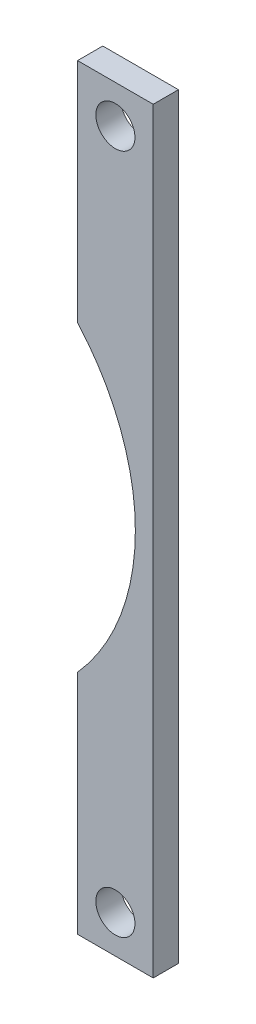
ISO-10303-21;
HEADER;
FILE_DESCRIPTION(('STEP AP214'),'2;1');
FILE_NAME('part.step','',(''),(''),'','','');
FILE_SCHEMA(('AUTOMOTIVE_DESIGN { 1 0 10303 214 1 1 1 1 }'));
ENDSEC;
DATA;
#1=APPLICATION_CONTEXT('core data for automotive mechanical design processes');
#2=APPLICATION_PROTOCOL_DEFINITION('international standard','automotive_design',2000,#1);
#3=PRODUCT_CONTEXT('',#1,'mechanical');
#4=PRODUCT('Part','Part','',(#3));
#5=PRODUCT_RELATED_PRODUCT_CATEGORY('part','',(#4));
#6=PRODUCT_DEFINITION_FORMATION('','',#4);
#7=PRODUCT_DEFINITION_CONTEXT('part definition',#1,'design');
#8=PRODUCT_DEFINITION('design','',#6,#7);
#9=PRODUCT_DEFINITION_SHAPE('','',#8);
#10=(LENGTH_UNIT() NAMED_UNIT(*) SI_UNIT(.MILLI.,.METRE.));
#11=(NAMED_UNIT(*) PLANE_ANGLE_UNIT() SI_UNIT($,.RADIAN.));
#12=(NAMED_UNIT(*) SI_UNIT($,.STERADIAN.) SOLID_ANGLE_UNIT());
#13=UNCERTAINTY_MEASURE_WITH_UNIT(LENGTH_MEASURE(1.E-05),#10,'distance_accuracy_value','');
#14=(GEOMETRIC_REPRESENTATION_CONTEXT(3) GLOBAL_UNCERTAINTY_ASSIGNED_CONTEXT((#13)) GLOBAL_UNIT_ASSIGNED_CONTEXT((#10,
#11,#12)) REPRESENTATION_CONTEXT('',''));
#15=CARTESIAN_POINT('',(0.,0.,0.));
#16=DIRECTION('',(0.,0.,1.));
#17=DIRECTION('',(1.,0.,0.));
#18=AXIS2_PLACEMENT_3D('',#15,#16,#17);
#19=CARTESIAN_POINT('',(-3.,-30.,2.));
#20=DIRECTION('',(1.,0.,0.));
#21=DIRECTION('',(0.,0.,-1.));
#22=AXIS2_PLACEMENT_3D('',#19,#20,#21);
#23=PLANE('',#22);
#24=DIRECTION('',(0.,-1.,0.));
#25=VECTOR('',#24,1.);
#26=CARTESIAN_POINT('',(-3.,-30.,0.));
#27=LINE('',#26,#25);
#28=CARTESIAN_POINT('',(-3.,30.,0.));
#29=VERTEX_POINT('',#28);
#30=CARTESIAN_POINT('',(-3.,12.,0.));
#31=VERTEX_POINT('',#30);
#32=EDGE_CURVE('E106',#29,#31,#27,.T.);
#33=ORIENTED_EDGE('',*,*,#32,.T.);
#34=DIRECTION('',(0.,0.,1.));
#35=VECTOR('',#34,1.);
#36=CARTESIAN_POINT('',(-3.,12.,0.));
#37=LINE('',#36,#35);
#38=CARTESIAN_POINT('',(-3.,12.,2.));
#39=VERTEX_POINT('',#38);
#40=EDGE_CURVE('E93',#31,#39,#37,.T.);
#41=ORIENTED_EDGE('',*,*,#40,.T.);
#42=DIRECTION('',(0.,-1.,0.));
#43=VECTOR('',#42,1.);
#44=CARTESIAN_POINT('',(-3.,-30.,2.));
#45=LINE('',#44,#43);
#46=CARTESIAN_POINT('',(-3.,30.,2.));
#47=VERTEX_POINT('',#46);
#48=EDGE_CURVE('E150',#47,#39,#45,.T.);
#49=ORIENTED_EDGE('',*,*,#48,.F.);
#50=DIRECTION('',(0.,0.,-1.));
#51=VECTOR('',#50,1.);
#52=CARTESIAN_POINT('',(-3.,30.,2.));
#53=LINE('',#52,#51);
#54=EDGE_CURVE('E110',#47,#29,#53,.T.);
#55=ORIENTED_EDGE('',*,*,#54,.T.);
#56=EDGE_LOOP('',(#33,#41,#49,#55));
#57=FACE_BOUND('',#56,.T.);
#58=ADVANCED_FACE('F32',(#57),#23,.F.);
#59=CARTESIAN_POINT('',(0.,0.,2.));
#60=DIRECTION('',(0.,0.,1.));
#61=DIRECTION('',(1.,0.,0.));
#62=AXIS2_PLACEMENT_3D('',#59,#60,#61);
#63=PLANE('',#62);
#64=CARTESIAN_POINT('',(-16.4164078649987,0.,2.));
#65=DIRECTION('',(0.,0.,1.));
#66=DIRECTION('',(-1.,0.,0.));
#67=AXIS2_PLACEMENT_3D('',#64,#65,#66);
#68=CIRCLE('',#67,18.);
#69=CARTESIAN_POINT('',(-3.,-12.,2.));
#70=VERTEX_POINT('',#69);
#71=EDGE_CURVE('E95',#70,#39,#68,.T.);
#72=ORIENTED_EDGE('',*,*,#71,.F.);
#73=CARTESIAN_POINT('',(-3.,-30.,2.));
#74=VERTEX_POINT('',#73);
#75=EDGE_CURVE('E84',#70,#74,#45,.T.);
#76=ORIENTED_EDGE('',*,*,#75,.T.);
#77=DIRECTION('',(1.,0.,0.));
#78=VECTOR('',#77,1.);
#79=CARTESIAN_POINT('',(3.,-30.,2.));
#80=LINE('',#79,#78);
#81=CARTESIAN_POINT('',(3.,-30.,2.));
#82=VERTEX_POINT('',#81);
#83=EDGE_CURVE('E134',#74,#82,#80,.T.);
#84=ORIENTED_EDGE('',*,*,#83,.T.);
#85=DIRECTION('',(0.,1.,0.));
#86=VECTOR('',#85,1.);
#87=CARTESIAN_POINT('',(3.,-30.,2.));
#88=LINE('',#87,#86);
#89=CARTESIAN_POINT('',(3.,30.,2.));
#90=VERTEX_POINT('',#89);
#91=EDGE_CURVE('E130',#82,#90,#88,.T.);
#92=ORIENTED_EDGE('',*,*,#91,.T.);
#93=DIRECTION('',(-1.,0.,0.));
#94=VECTOR('',#93,1.);
#95=CARTESIAN_POINT('',(3.,30.,2.));
#96=LINE('',#95,#94);
#97=EDGE_CURVE('E56',#90,#47,#96,.T.);
#98=ORIENTED_EDGE('',*,*,#97,.T.);
#99=ORIENTED_EDGE('',*,*,#48,.T.);
#100=EDGE_LOOP('',(#72,#76,#84,#92,#98,#99));
#101=FACE_BOUND('',#100,.T.);
#102=CARTESIAN_POINT('',(0.,27.,2.));
#103=DIRECTION('',(0.,0.,1.));
#104=DIRECTION('',(1.,0.,0.));
#105=AXIS2_PLACEMENT_3D('',#102,#103,#104);
#106=CIRCLE('',#105,1.55);
#107=CARTESIAN_POINT('',(1.55,27.,2.));
#108=VERTEX_POINT('',#107);
#109=EDGE_CURVE('E115',#108,#108,#106,.T.);
#110=ORIENTED_EDGE('',*,*,#109,.F.);
#111=EDGE_LOOP('',(#110));
#112=FACE_BOUND('',#111,.T.);
#113=CARTESIAN_POINT('',(0.,-27.,2.));
#114=DIRECTION('',(0.,0.,1.));
#115=DIRECTION('',(1.,0.,0.));
#116=AXIS2_PLACEMENT_3D('',#113,#114,#115);
#117=CIRCLE('',#116,1.55);
#118=CARTESIAN_POINT('',(1.55,-27.,2.));
#119=VERTEX_POINT('',#118);
#120=EDGE_CURVE('E139',#119,#119,#117,.T.);
#121=ORIENTED_EDGE('',*,*,#120,.F.);
#122=EDGE_LOOP('',(#121));
#123=FACE_BOUND('',#122,.T.);
#124=ADVANCED_FACE('F152',(#101,#112,#123),#63,.T.);
#125=CARTESIAN_POINT('',(0.,0.,0.));
#126=DIRECTION('',(0.,0.,1.));
#127=DIRECTION('',(1.,0.,0.));
#128=AXIS2_PLACEMENT_3D('',#125,#126,#127);
#129=PLANE('',#128);
#130=CARTESIAN_POINT('',(-3.,-12.,0.));
#131=VERTEX_POINT('',#130);
#132=CARTESIAN_POINT('',(-3.,-30.,0.));
#133=VERTEX_POINT('',#132);
#134=EDGE_CURVE('E108',#131,#133,#27,.T.);
#135=ORIENTED_EDGE('',*,*,#134,.F.);
#136=CARTESIAN_POINT('',(-16.4164078649987,0.,0.));
#137=DIRECTION('',(0.,0.,1.));
#138=DIRECTION('',(-1.,0.,0.));
#139=AXIS2_PLACEMENT_3D('',#136,#137,#138);
#140=CIRCLE('',#139,18.);
#141=EDGE_CURVE('E47',#131,#31,#140,.T.);
#142=ORIENTED_EDGE('',*,*,#141,.T.);
#143=ORIENTED_EDGE('',*,*,#32,.F.);
#144=DIRECTION('',(-1.,0.,0.));
#145=VECTOR('',#144,1.);
#146=CARTESIAN_POINT('',(3.,30.,0.));
#147=LINE('',#146,#145);
#148=CARTESIAN_POINT('',(3.,30.,0.));
#149=VERTEX_POINT('',#148);
#150=EDGE_CURVE('E77',#149,#29,#147,.T.);
#151=ORIENTED_EDGE('',*,*,#150,.F.);
#152=DIRECTION('',(0.,1.,0.));
#153=VECTOR('',#152,1.);
#154=CARTESIAN_POINT('',(3.,-30.,0.));
#155=LINE('',#154,#153);
#156=CARTESIAN_POINT('',(3.,-30.,0.));
#157=VERTEX_POINT('',#156);
#158=EDGE_CURVE('E113',#157,#149,#155,.T.);
#159=ORIENTED_EDGE('',*,*,#158,.F.);
#160=DIRECTION('',(1.,0.,0.));
#161=VECTOR('',#160,1.);
#162=CARTESIAN_POINT('',(3.,-30.,0.));
#163=LINE('',#162,#161);
#164=EDGE_CURVE('E111',#133,#157,#163,.T.);
#165=ORIENTED_EDGE('',*,*,#164,.F.);
#166=EDGE_LOOP('',(#135,#142,#143,#151,#159,#165));
#167=FACE_BOUND('',#166,.T.);
#168=CARTESIAN_POINT('',(0.,27.,0.));
#169=DIRECTION('',(0.,0.,1.));
#170=DIRECTION('',(1.,0.,0.));
#171=AXIS2_PLACEMENT_3D('',#168,#169,#170);
#172=CIRCLE('',#171,1.55);
#173=CARTESIAN_POINT('',(1.55,27.,0.));
#174=VERTEX_POINT('',#173);
#175=EDGE_CURVE('E144',#174,#174,#172,.T.);
#176=ORIENTED_EDGE('',*,*,#175,.T.);
#177=EDGE_LOOP('',(#176));
#178=FACE_BOUND('',#177,.T.);
#179=CARTESIAN_POINT('',(0.,-27.,0.));
#180=DIRECTION('',(0.,0.,1.));
#181=DIRECTION('',(1.,0.,0.));
#182=AXIS2_PLACEMENT_3D('',#179,#180,#181);
#183=CIRCLE('',#182,1.55);
#184=CARTESIAN_POINT('',(1.55,-27.,0.));
#185=VERTEX_POINT('',#184);
#186=EDGE_CURVE('E136',#185,#185,#183,.T.);
#187=ORIENTED_EDGE('',*,*,#186,.T.);
#188=EDGE_LOOP('',(#187));
#189=FACE_BOUND('',#188,.T.);
#190=ADVANCED_FACE('F104',(#167,#178,#189),#129,.F.);
#191=ORIENTED_EDGE('',*,*,#75,.F.);
#192=DIRECTION('',(0.,0.,1.));
#193=VECTOR('',#192,1.);
#194=CARTESIAN_POINT('',(-3.,-12.,0.));
#195=LINE('',#194,#193);
#196=EDGE_CURVE('E99',#131,#70,#195,.T.);
#197=ORIENTED_EDGE('',*,*,#196,.F.);
#198=ORIENTED_EDGE('',*,*,#134,.T.);
#199=DIRECTION('',(0.,0.,-1.));
#200=VECTOR('',#199,1.);
#201=CARTESIAN_POINT('',(-3.,-30.,2.));
#202=LINE('',#201,#200);
#203=EDGE_CURVE('E11',#74,#133,#202,.T.);
#204=ORIENTED_EDGE('',*,*,#203,.F.);
#205=EDGE_LOOP('',(#191,#197,#198,#204));
#206=FACE_BOUND('',#205,.T.);
#207=ADVANCED_FACE('F34',(#206),#23,.F.);
#208=CARTESIAN_POINT('',(3.,-30.,2.));
#209=DIRECTION('',(0.,1.,0.));
#210=DIRECTION('',(0.,0.,1.));
#211=AXIS2_PLACEMENT_3D('',#208,#209,#210);
#212=PLANE('',#211);
#213=ORIENTED_EDGE('',*,*,#164,.T.);
#214=DIRECTION('',(0.,0.,-1.));
#215=VECTOR('',#214,1.);
#216=CARTESIAN_POINT('',(3.,-30.,2.));
#217=LINE('',#216,#215);
#218=EDGE_CURVE('E40',#82,#157,#217,.T.);
#219=ORIENTED_EDGE('',*,*,#218,.F.);
#220=ORIENTED_EDGE('',*,*,#83,.F.);
#221=ORIENTED_EDGE('',*,*,#203,.T.);
#222=EDGE_LOOP('',(#213,#219,#220,#221));
#223=FACE_BOUND('',#222,.T.);
#224=ADVANCED_FACE('F133',(#223),#212,.F.);
#225=CARTESIAN_POINT('',(3.,-30.,2.));
#226=DIRECTION('',(-1.,0.,0.));
#227=DIRECTION('',(0.,0.,1.));
#228=AXIS2_PLACEMENT_3D('',#225,#226,#227);
#229=PLANE('',#228);
#230=ORIENTED_EDGE('',*,*,#158,.T.);
#231=DIRECTION('',(0.,0.,-1.));
#232=VECTOR('',#231,1.);
#233=CARTESIAN_POINT('',(3.,30.,2.));
#234=LINE('',#233,#232);
#235=EDGE_CURVE('E122',#90,#149,#234,.T.);
#236=ORIENTED_EDGE('',*,*,#235,.F.);
#237=ORIENTED_EDGE('',*,*,#91,.F.);
#238=ORIENTED_EDGE('',*,*,#218,.T.);
#239=EDGE_LOOP('',(#230,#236,#237,#238));
#240=FACE_BOUND('',#239,.T.);
#241=ADVANCED_FACE('F128',(#240),#229,.F.);
#242=CARTESIAN_POINT('',(3.,30.,2.));
#243=DIRECTION('',(0.,-1.,0.));
#244=DIRECTION('',(0.,0.,-1.));
#245=AXIS2_PLACEMENT_3D('',#242,#243,#244);
#246=PLANE('',#245);
#247=ORIENTED_EDGE('',*,*,#150,.T.);
#248=ORIENTED_EDGE('',*,*,#54,.F.);
#249=ORIENTED_EDGE('',*,*,#97,.F.);
#250=ORIENTED_EDGE('',*,*,#235,.T.);
#251=EDGE_LOOP('',(#247,#248,#249,#250));
#252=FACE_BOUND('',#251,.T.);
#253=ADVANCED_FACE('F154',(#252),#246,.F.);
#254=CARTESIAN_POINT('',(0.,27.,2.));
#255=DIRECTION('',(0.,0.,-1.));
#256=DIRECTION('',(-1.,0.,0.));
#257=AXIS2_PLACEMENT_3D('',#254,#255,#256);
#258=CYLINDRICAL_SURFACE('',#257,1.55);
#259=ORIENTED_EDGE('',*,*,#109,.T.);
#260=EDGE_LOOP('',(#259));
#261=FACE_BOUND('',#260,.T.);
#262=ORIENTED_EDGE('',*,*,#175,.F.);
#263=EDGE_LOOP('',(#262));
#264=FACE_BOUND('',#263,.T.);
#265=ADVANCED_FACE('F156',(#261,#264),#258,.F.);
#266=CARTESIAN_POINT('',(0.,-27.,2.));
#267=DIRECTION('',(0.,0.,-1.));
#268=DIRECTION('',(-1.,0.,0.));
#269=AXIS2_PLACEMENT_3D('',#266,#267,#268);
#270=CYLINDRICAL_SURFACE('',#269,1.55);
#271=ORIENTED_EDGE('',*,*,#120,.T.);
#272=EDGE_LOOP('',(#271));
#273=FACE_BOUND('',#272,.T.);
#274=ORIENTED_EDGE('',*,*,#186,.F.);
#275=EDGE_LOOP('',(#274));
#276=FACE_BOUND('',#275,.T.);
#277=ADVANCED_FACE('F162',(#273,#276),#270,.F.);
#278=CARTESIAN_POINT('',(-16.4164078649987,0.,0.));
#279=DIRECTION('',(0.,0.,1.));
#280=DIRECTION('',(1.,0.,0.));
#281=AXIS2_PLACEMENT_3D('',#278,#279,#280);
#282=CYLINDRICAL_SURFACE('',#281,18.);
#283=ORIENTED_EDGE('',*,*,#71,.T.);
#284=ORIENTED_EDGE('',*,*,#40,.F.);
#285=ORIENTED_EDGE('',*,*,#141,.F.);
#286=ORIENTED_EDGE('',*,*,#196,.T.);
#287=EDGE_LOOP('',(#283,#284,#285,#286));
#288=FACE_BOUND('',#287,.T.);
#289=ADVANCED_FACE('F94',(#288),#282,.F.);
#290=CLOSED_SHELL('',(#58,#124,#190,#207,#224,#241,#253,#265,#277,#289));
#291=MANIFOLD_SOLID_BREP('B2',#290);
#292=ADVANCED_BREP_SHAPE_REPRESENTATION('',(#18,#291),#14);
#293=SHAPE_DEFINITION_REPRESENTATION(#9,#292);
ENDSEC;
END-ISO-10303-21;
